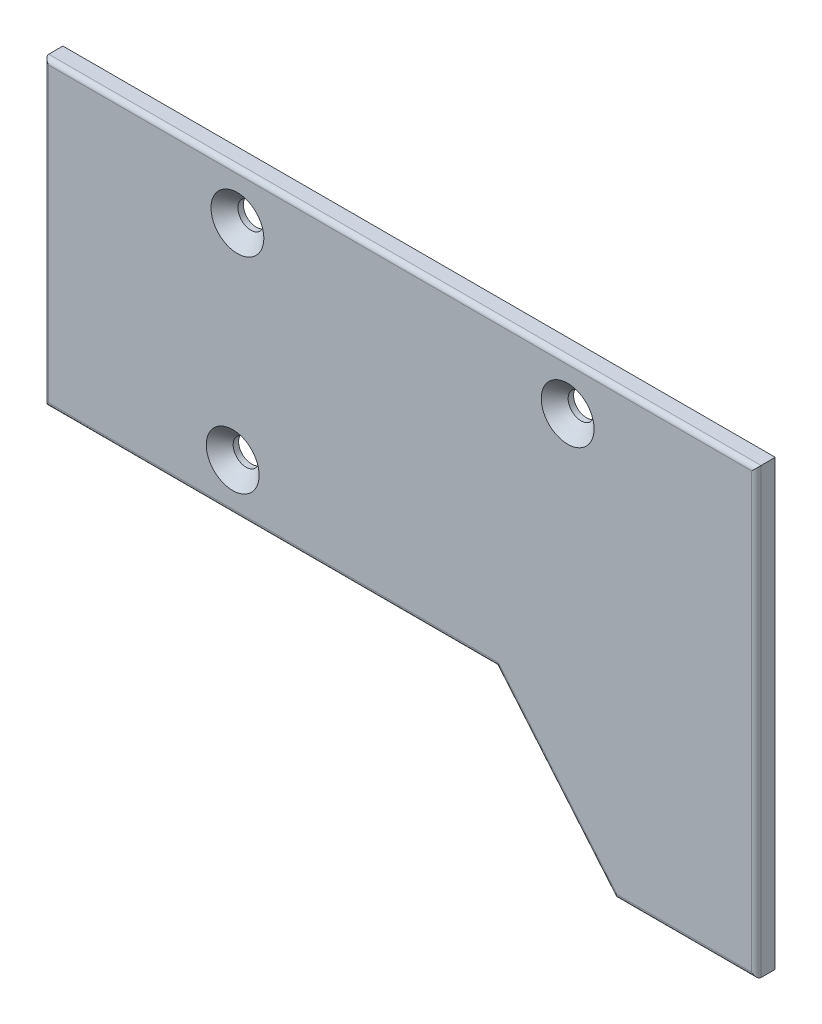
ISO-10303-21;
HEADER;
FILE_DESCRIPTION(('STEP AP214'),'2;1');
FILE_NAME('part.step','',(''),(''),'','','');
FILE_SCHEMA(('AUTOMOTIVE_DESIGN { 1 0 10303 214 1 1 1 1 }'));
ENDSEC;
DATA;
#1=APPLICATION_CONTEXT('core data for automotive mechanical design processes');
#2=APPLICATION_PROTOCOL_DEFINITION('international standard','automotive_design',2000,#1);
#3=PRODUCT_CONTEXT('',#1,'mechanical');
#4=PRODUCT('Part','Part','',(#3));
#5=PRODUCT_RELATED_PRODUCT_CATEGORY('part','',(#4));
#6=PRODUCT_DEFINITION_FORMATION('','',#4);
#7=PRODUCT_DEFINITION_CONTEXT('part definition',#1,'design');
#8=PRODUCT_DEFINITION('design','',#6,#7);
#9=PRODUCT_DEFINITION_SHAPE('','',#8);
#10=(LENGTH_UNIT() NAMED_UNIT(*) SI_UNIT(.MILLI.,.METRE.));
#11=(NAMED_UNIT(*) PLANE_ANGLE_UNIT() SI_UNIT($,.RADIAN.));
#12=(NAMED_UNIT(*) SI_UNIT($,.STERADIAN.) SOLID_ANGLE_UNIT());
#13=UNCERTAINTY_MEASURE_WITH_UNIT(LENGTH_MEASURE(1.E-05),#10,'distance_accuracy_value','');
#14=(GEOMETRIC_REPRESENTATION_CONTEXT(3) GLOBAL_UNCERTAINTY_ASSIGNED_CONTEXT((#13)) GLOBAL_UNIT_ASSIGNED_CONTEXT((#10,
#11,#12)) REPRESENTATION_CONTEXT('',''));
#15=CARTESIAN_POINT('',(0.,0.,0.));
#16=DIRECTION('',(0.,0.,1.));
#17=DIRECTION('',(1.,0.,0.));
#18=AXIS2_PLACEMENT_3D('',#15,#16,#17);
#19=CARTESIAN_POINT('',(0.,0.,4.));
#20=DIRECTION('',(0.,0.,-1.));
#21=DIRECTION('',(-1.,0.,0.));
#22=AXIS2_PLACEMENT_3D('',#19,#20,#21);
#23=PLANE('',#22);
#24=DIRECTION('',(1.,0.,0.));
#25=VECTOR('',#24,1.);
#26=CARTESIAN_POINT('',(0.,-28.9999999999999,4.));
#27=LINE('',#26,#25);
#28=CARTESIAN_POINT('',(121.466307658155,-29.,4.));
#29=VERTEX_POINT('',#28);
#30=CARTESIAN_POINT('',(150.,-29.,4.));
#31=VERTEX_POINT('',#30);
#32=EDGE_CURVE('E164',#29,#31,#27,.T.);
#33=ORIENTED_EDGE('',*,*,#32,.T.);
#34=DIRECTION('',(0.,1.,0.));
#35=VECTOR('',#34,1.);
#36=CARTESIAN_POINT('',(150.,0.,4.));
#37=LINE('',#36,#35);
#38=CARTESIAN_POINT('',(150.,63.,4.));
#39=VERTEX_POINT('',#38);
#40=EDGE_CURVE('E166',#31,#39,#37,.T.);
#41=ORIENTED_EDGE('',*,*,#40,.T.);
#42=DIRECTION('',(-1.,0.,0.));
#43=VECTOR('',#42,1.);
#44=CARTESIAN_POINT('',(0.,63.,4.));
#45=LINE('',#44,#43);
#46=CARTESIAN_POINT('',(1.,63.,4.));
#47=VERTEX_POINT('',#46);
#48=EDGE_CURVE('E117',#39,#47,#45,.T.);
#49=ORIENTED_EDGE('',*,*,#48,.T.);
#50=DIRECTION('',(0.,-1.,0.));
#51=VECTOR('',#50,1.);
#52=CARTESIAN_POINT('',(1.,0.,4.));
#53=LINE('',#52,#51);
#54=CARTESIAN_POINT('',(1.,1.,4.));
#55=VERTEX_POINT('',#54);
#56=EDGE_CURVE('E158',#47,#55,#53,.T.);
#57=ORIENTED_EDGE('',*,*,#56,.T.);
#58=DIRECTION('',(1.,0.,0.));
#59=VECTOR('',#58,1.);
#60=CARTESIAN_POINT('',(0.,1.,4.));
#61=LINE('',#60,#59);
#62=CARTESIAN_POINT('',(96.2933187228367,1.,4.));
#63=VERTEX_POINT('',#62);
#64=EDGE_CURVE('E160',#55,#63,#61,.T.);
#65=ORIENTED_EDGE('',*,*,#64,.T.);
#66=DIRECTION('',(0.642787609686538,-0.766044443118979,0.));
#67=VECTOR('',#66,1.);
#68=CARTESIAN_POINT('',(56.9996428967854,47.8283793319291,4.));
#69=LINE('',#68,#67);
#70=EDGE_CURVE('E162',#63,#29,#69,.T.);
#71=ORIENTED_EDGE('',*,*,#70,.T.);
#72=EDGE_LOOP('',(#33,#41,#49,#57,#65,#71));
#73=FACE_BOUND('',#72,.T.);
#74=CARTESIAN_POINT('',(40.,9.99999999999999,4.));
#75=DIRECTION('',(0.,0.,1.));
#76=DIRECTION('',(1.,0.,0.));
#77=AXIS2_PLACEMENT_3D('',#74,#75,#76);
#78=CIRCLE('',#77,5.6);
#79=CARTESIAN_POINT('',(45.6,9.99999999999999,4.));
#80=VERTEX_POINT('',#79);
#81=EDGE_CURVE('E205',#80,#80,#78,.T.);
#82=ORIENTED_EDGE('',*,*,#81,.F.);
#83=EDGE_LOOP('',(#82));
#84=FACE_BOUND('',#83,.T.);
#85=CARTESIAN_POINT('',(111.,54.,4.));
#86=DIRECTION('',(0.,0.,1.));
#87=DIRECTION('',(1.,0.,0.));
#88=AXIS2_PLACEMENT_3D('',#85,#86,#87);
#89=CIRCLE('',#88,5.59999999999999);
#90=CARTESIAN_POINT('',(116.6,54.,4.));
#91=VERTEX_POINT('',#90);
#92=EDGE_CURVE('E211',#91,#91,#89,.T.);
#93=ORIENTED_EDGE('',*,*,#92,.F.);
#94=EDGE_LOOP('',(#93));
#95=FACE_BOUND('',#94,.T.);
#96=CARTESIAN_POINT('',(41.,54.,4.));
#97=DIRECTION('',(0.,0.,1.));
#98=DIRECTION('',(1.,0.,0.));
#99=AXIS2_PLACEMENT_3D('',#96,#97,#98);
#100=CIRCLE('',#99,5.6);
#101=CARTESIAN_POINT('',(46.6,54.,4.));
#102=VERTEX_POINT('',#101);
#103=EDGE_CURVE('E217',#102,#102,#100,.T.);
#104=ORIENTED_EDGE('',*,*,#103,.F.);
#105=EDGE_LOOP('',(#104));
#106=FACE_BOUND('',#105,.T.);
#107=ADVANCED_FACE('F37',(#73,#84,#95,#106),#23,.F.);
#108=CARTESIAN_POINT('',(41.,54.,4.));
#109=DIRECTION('',(0.,0.,-1.));
#110=DIRECTION('',(-1.,0.,0.));
#111=AXIS2_PLACEMENT_3D('',#108,#109,#110);
#112=CYLINDRICAL_SURFACE('',#111,2.75);
#113=CARTESIAN_POINT('',(41.,54.,0.));
#114=DIRECTION('',(0.,0.,1.));
#115=DIRECTION('',(1.,0.,0.));
#116=AXIS2_PLACEMENT_3D('',#113,#114,#115);
#117=CIRCLE('',#116,2.75);
#118=CARTESIAN_POINT('',(43.75,54.,0.));
#119=VERTEX_POINT('',#118);
#120=EDGE_CURVE('E133',#119,#119,#117,.T.);
#121=ORIENTED_EDGE('',*,*,#120,.F.);
#122=EDGE_LOOP('',(#121));
#123=FACE_BOUND('',#122,.T.);
#124=CARTESIAN_POINT('',(41.,54.,1.15));
#125=DIRECTION('',(0.,0.,1.));
#126=DIRECTION('',(1.,0.,0.));
#127=AXIS2_PLACEMENT_3D('',#124,#125,#126);
#128=CIRCLE('',#127,2.75);
#129=CARTESIAN_POINT('',(43.75,54.,1.15));
#130=VERTEX_POINT('',#129);
#131=EDGE_CURVE('E214',#130,#130,#128,.T.);
#132=ORIENTED_EDGE('',*,*,#131,.T.);
#133=EDGE_LOOP('',(#132));
#134=FACE_BOUND('',#133,.T.);
#135=ADVANCED_FACE('F224',(#123,#134),#112,.F.);
#136=CARTESIAN_POINT('',(40.,9.99999999999999,4.));
#137=DIRECTION('',(0.,0.,-1.));
#138=DIRECTION('',(-1.,0.,0.));
#139=AXIS2_PLACEMENT_3D('',#136,#137,#138);
#140=CYLINDRICAL_SURFACE('',#139,2.75);
#141=CARTESIAN_POINT('',(40.,9.99999999999999,0.));
#142=DIRECTION('',(0.,0.,1.));
#143=DIRECTION('',(1.,0.,0.));
#144=AXIS2_PLACEMENT_3D('',#141,#142,#143);
#145=CIRCLE('',#144,2.75);
#146=CARTESIAN_POINT('',(42.75,9.99999999999999,0.));
#147=VERTEX_POINT('',#146);
#148=EDGE_CURVE('E193',#147,#147,#145,.T.);
#149=ORIENTED_EDGE('',*,*,#148,.F.);
#150=EDGE_LOOP('',(#149));
#151=FACE_BOUND('',#150,.T.);
#152=CARTESIAN_POINT('',(40.,9.99999999999999,1.15));
#153=DIRECTION('',(0.,0.,1.));
#154=DIRECTION('',(1.,0.,0.));
#155=AXIS2_PLACEMENT_3D('',#152,#153,#154);
#156=CIRCLE('',#155,2.75);
#157=CARTESIAN_POINT('',(42.75,9.99999999999999,1.15));
#158=VERTEX_POINT('',#157);
#159=EDGE_CURVE('E180',#158,#158,#156,.T.);
#160=ORIENTED_EDGE('',*,*,#159,.T.);
#161=EDGE_LOOP('',(#160));
#162=FACE_BOUND('',#161,.T.);
#163=ADVANCED_FACE('F230',(#151,#162),#140,.F.);
#164=CARTESIAN_POINT('',(0.,0.,0.));
#165=DIRECTION('',(0.,0.,-1.));
#166=DIRECTION('',(-1.,0.,0.));
#167=AXIS2_PLACEMENT_3D('',#164,#165,#166);
#168=PLANE('',#167);
#169=CARTESIAN_POINT('',(111.,54.,0.));
#170=DIRECTION('',(0.,0.,1.));
#171=DIRECTION('',(1.,0.,0.));
#172=AXIS2_PLACEMENT_3D('',#169,#170,#171);
#173=CIRCLE('',#172,2.75000000000001);
#174=CARTESIAN_POINT('',(113.75,54.,0.));
#175=VERTEX_POINT('',#174);
#176=EDGE_CURVE('E136',#175,#175,#173,.T.);
#177=ORIENTED_EDGE('',*,*,#176,.T.);
#178=EDGE_LOOP('',(#177));
#179=FACE_BOUND('',#178,.T.);
#180=DIRECTION('',(1.,0.,0.));
#181=VECTOR('',#180,1.);
#182=CARTESIAN_POINT('',(95.8270110646818,0.,0.));
#183=LINE('',#182,#181);
#184=CARTESIAN_POINT('',(0.,0.,0.));
#185=VERTEX_POINT('',#184);
#186=CARTESIAN_POINT('',(95.8270110646818,0.,0.));
#187=VERTEX_POINT('',#186);
#188=EDGE_CURVE('E125',#185,#187,#183,.T.);
#189=ORIENTED_EDGE('',*,*,#188,.F.);
#190=DIRECTION('',(0.,-1.,0.));
#191=VECTOR('',#190,1.);
#192=CARTESIAN_POINT('',(0.,0.,0.));
#193=LINE('',#192,#191);
#194=CARTESIAN_POINT('',(0.,64.,0.));
#195=VERTEX_POINT('',#194);
#196=EDGE_CURVE('E147',#195,#185,#193,.T.);
#197=ORIENTED_EDGE('',*,*,#196,.F.);
#198=DIRECTION('',(-1.,0.,0.));
#199=VECTOR('',#198,1.);
#200=CARTESIAN_POINT('',(0.,64.,0.));
#201=LINE('',#200,#199);
#202=CARTESIAN_POINT('',(151.,64.,0.));
#203=VERTEX_POINT('',#202);
#204=EDGE_CURVE('E144',#203,#195,#201,.T.);
#205=ORIENTED_EDGE('',*,*,#204,.F.);
#206=DIRECTION('',(0.,1.,0.));
#207=VECTOR('',#206,1.);
#208=CARTESIAN_POINT('',(151.,64.,0.));
#209=LINE('',#208,#207);
#210=CARTESIAN_POINT('',(151.,-30.,0.));
#211=VERTEX_POINT('',#210);
#212=EDGE_CURVE('E141',#211,#203,#209,.T.);
#213=ORIENTED_EDGE('',*,*,#212,.F.);
#214=DIRECTION('',(1.,0.,0.));
#215=VECTOR('',#214,1.);
#216=CARTESIAN_POINT('',(151.,-30.,0.));
#217=LINE('',#216,#215);
#218=CARTESIAN_POINT('',(121.,-30.,0.));
#219=VERTEX_POINT('',#218);
#220=EDGE_CURVE('E128',#219,#211,#217,.T.);
#221=ORIENTED_EDGE('',*,*,#220,.F.);
#222=DIRECTION('',(0.642787609686538,-0.766044443118979,0.));
#223=VECTOR('',#222,1.);
#224=CARTESIAN_POINT('',(121.,-30.,0.));
#225=LINE('',#224,#223);
#226=EDGE_CURVE('E112',#187,#219,#225,.T.);
#227=ORIENTED_EDGE('',*,*,#226,.F.);
#228=EDGE_LOOP('',(#189,#197,#205,#213,#221,#227));
#229=FACE_BOUND('',#228,.T.);
#230=ORIENTED_EDGE('',*,*,#120,.T.);
#231=EDGE_LOOP('',(#230));
#232=FACE_BOUND('',#231,.T.);
#233=ORIENTED_EDGE('',*,*,#148,.T.);
#234=EDGE_LOOP('',(#233));
#235=FACE_BOUND('',#234,.T.);
#236=ADVANCED_FACE('F122',(#179,#229,#232,#235),#168,.T.);
#237=CARTESIAN_POINT('',(95.8270110646818,0.,4.));
#238=DIRECTION('',(0.,1.,0.));
#239=DIRECTION('',(-1.,0.,0.));
#240=AXIS2_PLACEMENT_3D('',#237,#238,#239);
#241=PLANE('',#240);
#242=DIRECTION('',(0.,0.,-1.));
#243=VECTOR('',#242,1.);
#244=CARTESIAN_POINT('',(95.8270110646818,0.,4.));
#245=LINE('',#244,#243);
#246=CARTESIAN_POINT('',(95.8270110646818,0.,3.));
#247=VERTEX_POINT('',#246);
#248=EDGE_CURVE('E108',#247,#187,#245,.T.);
#249=ORIENTED_EDGE('',*,*,#248,.F.);
#250=DIRECTION('',(1.,0.,0.));
#251=VECTOR('',#250,1.);
#252=CARTESIAN_POINT('',(95.8270110646818,0.,3.));
#253=LINE('',#252,#251);
#254=CARTESIAN_POINT('',(0.,0.,3.));
#255=VERTEX_POINT('',#254);
#256=EDGE_CURVE('E61',#247,#255,#253,.F.);
#257=ORIENTED_EDGE('',*,*,#256,.T.);
#258=DIRECTION('',(0.,0.,-1.));
#259=VECTOR('',#258,1.);
#260=CARTESIAN_POINT('',(0.,0.,4.));
#261=LINE('',#260,#259);
#262=EDGE_CURVE('E131',#255,#185,#261,.T.);
#263=ORIENTED_EDGE('',*,*,#262,.T.);
#264=ORIENTED_EDGE('',*,*,#188,.T.);
#265=EDGE_LOOP('',(#249,#257,#263,#264));
#266=FACE_BOUND('',#265,.T.);
#267=ADVANCED_FACE('F130',(#266),#241,.F.);
#268=CARTESIAN_POINT('',(121.,-30.,4.));
#269=DIRECTION('',(0.766044443118979,0.642787609686538,0.));
#270=DIRECTION('',(-0.642787609686538,0.766044443118979,0.));
#271=AXIS2_PLACEMENT_3D('',#268,#269,#270);
#272=PLANE('',#271);
#273=DIRECTION('',(0.,0.,-1.));
#274=VECTOR('',#273,1.);
#275=CARTESIAN_POINT('',(121.,-30.,4.));
#276=LINE('',#275,#274);
#277=CARTESIAN_POINT('',(121.,-30.,3.));
#278=VERTEX_POINT('',#277);
#279=EDGE_CURVE('E118',#278,#219,#276,.T.);
#280=ORIENTED_EDGE('',*,*,#279,.F.);
#281=DIRECTION('',(0.642787609686538,-0.766044443118979,0.));
#282=VECTOR('',#281,1.);
#283=CARTESIAN_POINT('',(121.,-30.,3.));
#284=LINE('',#283,#282);
#285=EDGE_CURVE('E115',#278,#247,#284,.F.);
#286=ORIENTED_EDGE('',*,*,#285,.T.);
#287=ORIENTED_EDGE('',*,*,#248,.T.);
#288=ORIENTED_EDGE('',*,*,#226,.T.);
#289=EDGE_LOOP('',(#280,#286,#287,#288));
#290=FACE_BOUND('',#289,.T.);
#291=ADVANCED_FACE('F111',(#290),#272,.F.);
#292=CARTESIAN_POINT('',(151.,-30.,4.));
#293=DIRECTION('',(0.,1.,0.));
#294=DIRECTION('',(-1.,0.,0.));
#295=AXIS2_PLACEMENT_3D('',#292,#293,#294);
#296=PLANE('',#295);
#297=DIRECTION('',(0.,0.,-1.));
#298=VECTOR('',#297,1.);
#299=CARTESIAN_POINT('',(151.,-30.,4.));
#300=LINE('',#299,#298);
#301=CARTESIAN_POINT('',(151.,-30.,3.));
#302=VERTEX_POINT('',#301);
#303=EDGE_CURVE('E154',#302,#211,#300,.T.);
#304=ORIENTED_EDGE('',*,*,#303,.F.);
#305=DIRECTION('',(1.,0.,0.));
#306=VECTOR('',#305,1.);
#307=CARTESIAN_POINT('',(151.,-30.,3.));
#308=LINE('',#307,#306);
#309=EDGE_CURVE('E172',#302,#278,#308,.F.);
#310=ORIENTED_EDGE('',*,*,#309,.T.);
#311=ORIENTED_EDGE('',*,*,#279,.T.);
#312=ORIENTED_EDGE('',*,*,#220,.T.);
#313=EDGE_LOOP('',(#304,#310,#311,#312));
#314=FACE_BOUND('',#313,.T.);
#315=ADVANCED_FACE('F250',(#314),#296,.F.);
#316=CARTESIAN_POINT('',(151.,64.,4.));
#317=DIRECTION('',(-1.,0.,0.));
#318=DIRECTION('',(0.,-1.,0.));
#319=AXIS2_PLACEMENT_3D('',#316,#317,#318);
#320=PLANE('',#319);
#321=DIRECTION('',(0.,0.,-1.));
#322=VECTOR('',#321,1.);
#323=CARTESIAN_POINT('',(151.,64.,4.));
#324=LINE('',#323,#322);
#325=CARTESIAN_POINT('',(151.,64.,3.));
#326=VERTEX_POINT('',#325);
#327=EDGE_CURVE('E152',#326,#203,#324,.T.);
#328=ORIENTED_EDGE('',*,*,#327,.F.);
#329=DIRECTION('',(0.,1.,0.));
#330=VECTOR('',#329,1.);
#331=CARTESIAN_POINT('',(151.,64.,3.));
#332=LINE('',#331,#330);
#333=EDGE_CURVE('E169',#326,#302,#332,.F.);
#334=ORIENTED_EDGE('',*,*,#333,.T.);
#335=ORIENTED_EDGE('',*,*,#303,.T.);
#336=ORIENTED_EDGE('',*,*,#212,.T.);
#337=EDGE_LOOP('',(#328,#334,#335,#336));
#338=FACE_BOUND('',#337,.T.);
#339=ADVANCED_FACE('F246',(#338),#320,.F.);
#340=CARTESIAN_POINT('',(0.,64.,4.));
#341=DIRECTION('',(0.,-1.,0.));
#342=DIRECTION('',(0.,0.,-1.));
#343=AXIS2_PLACEMENT_3D('',#340,#341,#342);
#344=PLANE('',#343);
#345=DIRECTION('',(0.,0.,-1.));
#346=VECTOR('',#345,1.);
#347=CARTESIAN_POINT('',(0.,64.,4.));
#348=LINE('',#347,#346);
#349=CARTESIAN_POINT('',(0.,64.,3.));
#350=VERTEX_POINT('',#349);
#351=EDGE_CURVE('E150',#350,#195,#348,.T.);
#352=ORIENTED_EDGE('',*,*,#351,.F.);
#353=DIRECTION('',(-1.,0.,0.));
#354=VECTOR('',#353,1.);
#355=CARTESIAN_POINT('',(0.,64.,3.));
#356=LINE('',#355,#354);
#357=EDGE_CURVE('E11',#350,#326,#356,.F.);
#358=ORIENTED_EDGE('',*,*,#357,.T.);
#359=ORIENTED_EDGE('',*,*,#327,.T.);
#360=ORIENTED_EDGE('',*,*,#204,.T.);
#361=EDGE_LOOP('',(#352,#358,#359,#360));
#362=FACE_BOUND('',#361,.T.);
#363=ADVANCED_FACE('F243',(#362),#344,.F.);
#364=CARTESIAN_POINT('',(0.,0.,4.));
#365=DIRECTION('',(1.,0.,0.));
#366=DIRECTION('',(0.,0.,-1.));
#367=AXIS2_PLACEMENT_3D('',#364,#365,#366);
#368=PLANE('',#367);
#369=ORIENTED_EDGE('',*,*,#262,.F.);
#370=DIRECTION('',(0.,-1.,0.));
#371=VECTOR('',#370,1.);
#372=CARTESIAN_POINT('',(0.,0.,3.));
#373=LINE('',#372,#371);
#374=EDGE_CURVE('E46',#255,#350,#373,.F.);
#375=ORIENTED_EDGE('',*,*,#374,.T.);
#376=ORIENTED_EDGE('',*,*,#351,.T.);
#377=ORIENTED_EDGE('',*,*,#196,.T.);
#378=EDGE_LOOP('',(#369,#375,#376,#377));
#379=FACE_BOUND('',#378,.T.);
#380=ADVANCED_FACE('F239',(#379),#368,.F.);
#381=CARTESIAN_POINT('',(111.,54.,4.));
#382=DIRECTION('',(0.,0.,-1.));
#383=DIRECTION('',(-1.,0.,0.));
#384=AXIS2_PLACEMENT_3D('',#381,#382,#383);
#385=CYLINDRICAL_SURFACE('',#384,2.75000000000001);
#386=CARTESIAN_POINT('',(111.,54.,1.15));
#387=DIRECTION('',(0.,0.,1.));
#388=DIRECTION('',(1.,0.,0.));
#389=AXIS2_PLACEMENT_3D('',#386,#387,#388);
#390=CIRCLE('',#389,2.75);
#391=CARTESIAN_POINT('',(113.75,54.,1.15));
#392=VERTEX_POINT('',#391);
#393=EDGE_CURVE('E208',#392,#392,#390,.T.);
#394=ORIENTED_EDGE('',*,*,#393,.T.);
#395=EDGE_LOOP('',(#394));
#396=FACE_BOUND('',#395,.T.);
#397=ORIENTED_EDGE('',*,*,#176,.F.);
#398=EDGE_LOOP('',(#397));
#399=FACE_BOUND('',#398,.T.);
#400=ADVANCED_FACE('F242',(#396,#399),#385,.F.);
#401=CARTESIAN_POINT('',(0.,1.,3.));
#402=DIRECTION('',(1.,0.,0.));
#403=DIRECTION('',(0.,1.,0.));
#404=AXIS2_PLACEMENT_3D('',#401,#402,#403);
#405=CYLINDRICAL_SURFACE('',#404,1.);
#406=CARTESIAN_POINT('',(1.,1.,3.));
#407=DIRECTION('',(0.707106781186547,-0.707106781186547,0.));
#408=DIRECTION('',(-0.707106781186547,-0.707106781186547,0.));
#409=AXIS2_PLACEMENT_3D('',#406,#407,#408);
#410=ELLIPSE('',#409,1.41421356237309,1.);
#411=EDGE_CURVE('E187',#255,#55,#410,.F.);
#412=ORIENTED_EDGE('',*,*,#411,.F.);
#413=ORIENTED_EDGE('',*,*,#256,.F.);
#414=CARTESIAN_POINT('',(96.2933187228367,0.999999999999997,3.));
#415=DIRECTION('',(0.906307787036649,-0.4226182617407,0.));
#416=DIRECTION('',(-0.4226182617407,-0.906307787036649,0.));
#417=AXIS2_PLACEMENT_3D('',#414,#415,#416);
#418=ELLIPSE('',#417,1.10337791896249,1.);
#419=EDGE_CURVE('E41',#63,#247,#418,.T.);
#420=ORIENTED_EDGE('',*,*,#419,.F.);
#421=ORIENTED_EDGE('',*,*,#64,.F.);
#422=EDGE_LOOP('',(#412,#413,#420,#421));
#423=FACE_BOUND('',#422,.T.);
#424=ADVANCED_FACE('F39',(#423),#405,.T.);
#425=CARTESIAN_POINT('',(56.9996428967854,47.8283793319291,3.));
#426=DIRECTION('',(0.642787609686538,-0.766044443118979,0.));
#427=DIRECTION('',(0.766044443118979,0.642787609686538,0.));
#428=AXIS2_PLACEMENT_3D('',#425,#426,#427);
#429=CYLINDRICAL_SURFACE('',#428,1.);
#430=ORIENTED_EDGE('',*,*,#419,.T.);
#431=ORIENTED_EDGE('',*,*,#285,.F.);
#432=CARTESIAN_POINT('',(121.466307658155,-29.,3.));
#433=DIRECTION('',(0.906307787036649,-0.422618261740701,0.));
#434=DIRECTION('',(-0.422618261740701,-0.906307787036649,0.));
#435=AXIS2_PLACEMENT_3D('',#432,#433,#434);
#436=ELLIPSE('',#435,1.10337791896249,1.);
#437=EDGE_CURVE('E185',#29,#278,#436,.T.);
#438=ORIENTED_EDGE('',*,*,#437,.F.);
#439=ORIENTED_EDGE('',*,*,#70,.F.);
#440=EDGE_LOOP('',(#430,#431,#438,#439));
#441=FACE_BOUND('',#440,.T.);
#442=ADVANCED_FACE('F274',(#441),#429,.T.);
#443=CARTESIAN_POINT('',(1.,0.,3.));
#444=DIRECTION('',(0.,-1.,0.));
#445=DIRECTION('',(0.,0.,-1.));
#446=AXIS2_PLACEMENT_3D('',#443,#444,#445);
#447=CYLINDRICAL_SURFACE('',#446,1.);
#448=ORIENTED_EDGE('',*,*,#411,.T.);
#449=ORIENTED_EDGE('',*,*,#56,.F.);
#450=CARTESIAN_POINT('',(1.,63.,3.));
#451=DIRECTION('',(-0.707106781186547,-0.707106781186547,0.));
#452=DIRECTION('',(-0.707106781186547,0.707106781186547,0.));
#453=AXIS2_PLACEMENT_3D('',#450,#451,#452);
#454=ELLIPSE('',#453,1.41421356237309,1.);
#455=EDGE_CURVE('E182',#350,#47,#454,.F.);
#456=ORIENTED_EDGE('',*,*,#455,.F.);
#457=ORIENTED_EDGE('',*,*,#374,.F.);
#458=EDGE_LOOP('',(#448,#449,#456,#457));
#459=FACE_BOUND('',#458,.T.);
#460=ADVANCED_FACE('F271',(#459),#447,.T.);
#461=CARTESIAN_POINT('',(0.,-28.9999999999999,3.));
#462=DIRECTION('',(1.,0.,0.));
#463=DIRECTION('',(0.,1.,0.));
#464=AXIS2_PLACEMENT_3D('',#461,#462,#463);
#465=CYLINDRICAL_SURFACE('',#464,1.);
#466=ORIENTED_EDGE('',*,*,#437,.T.);
#467=ORIENTED_EDGE('',*,*,#309,.F.);
#468=CARTESIAN_POINT('',(150.,-29.,3.));
#469=DIRECTION('',(0.707106781186548,0.707106781186547,0.));
#470=DIRECTION('',(0.707106781186547,-0.707106781186548,0.));
#471=AXIS2_PLACEMENT_3D('',#468,#469,#470);
#472=ELLIPSE('',#471,1.4142135623731,1.);
#473=EDGE_CURVE('E179',#31,#302,#472,.T.);
#474=ORIENTED_EDGE('',*,*,#473,.F.);
#475=ORIENTED_EDGE('',*,*,#32,.F.);
#476=EDGE_LOOP('',(#466,#467,#474,#475));
#477=FACE_BOUND('',#476,.T.);
#478=ADVANCED_FACE('F267',(#477),#465,.T.);
#479=CARTESIAN_POINT('',(0.,63.,3.));
#480=DIRECTION('',(-1.,0.,0.));
#481=DIRECTION('',(0.,0.,1.));
#482=AXIS2_PLACEMENT_3D('',#479,#480,#481);
#483=CYLINDRICAL_SURFACE('',#482,1.);
#484=ORIENTED_EDGE('',*,*,#455,.T.);
#485=ORIENTED_EDGE('',*,*,#48,.F.);
#486=CARTESIAN_POINT('',(150.,63.,3.));
#487=DIRECTION('',(-0.707106781186548,0.707106781186547,0.));
#488=DIRECTION('',(-0.707106781186547,-0.707106781186548,0.));
#489=AXIS2_PLACEMENT_3D('',#486,#487,#488);
#490=ELLIPSE('',#489,1.41421356237309,1.);
#491=EDGE_CURVE('E177',#326,#39,#490,.F.);
#492=ORIENTED_EDGE('',*,*,#491,.F.);
#493=ORIENTED_EDGE('',*,*,#357,.F.);
#494=EDGE_LOOP('',(#484,#485,#492,#493));
#495=FACE_BOUND('',#494,.T.);
#496=ADVANCED_FACE('F263',(#495),#483,.T.);
#497=CARTESIAN_POINT('',(150.,0.,3.));
#498=DIRECTION('',(0.,1.,0.));
#499=DIRECTION('',(-1.,0.,0.));
#500=AXIS2_PLACEMENT_3D('',#497,#498,#499);
#501=CYLINDRICAL_SURFACE('',#500,1.);
#502=ORIENTED_EDGE('',*,*,#473,.T.);
#503=ORIENTED_EDGE('',*,*,#333,.F.);
#504=ORIENTED_EDGE('',*,*,#491,.T.);
#505=ORIENTED_EDGE('',*,*,#40,.F.);
#506=EDGE_LOOP('',(#502,#503,#504,#505));
#507=FACE_BOUND('',#506,.T.);
#508=ADVANCED_FACE('F259',(#507),#501,.T.);
#509=CARTESIAN_POINT('',(40.,9.99999999999999,4.));
#510=DIRECTION('',(0.,0.,1.));
#511=DIRECTION('',(1.,0.,0.));
#512=AXIS2_PLACEMENT_3D('',#509,#510,#511);
#513=CONICAL_SURFACE('',#512,5.6,0.785398163397449);
#514=ORIENTED_EDGE('',*,*,#159,.F.);
#515=EDGE_LOOP('',(#514));
#516=FACE_BOUND('',#515,.T.);
#517=ORIENTED_EDGE('',*,*,#81,.T.);
#518=EDGE_LOOP('',(#517));
#519=FACE_BOUND('',#518,.T.);
#520=ADVANCED_FACE('F262',(#516,#519),#513,.F.);
#521=CARTESIAN_POINT('',(111.,54.,4.));
#522=DIRECTION('',(0.,0.,1.));
#523=DIRECTION('',(1.,0.,0.));
#524=AXIS2_PLACEMENT_3D('',#521,#522,#523);
#525=CONICAL_SURFACE('',#524,5.59999999999999,0.785398163397447);
#526=ORIENTED_EDGE('',*,*,#393,.F.);
#527=EDGE_LOOP('',(#526));
#528=FACE_BOUND('',#527,.T.);
#529=ORIENTED_EDGE('',*,*,#92,.T.);
#530=EDGE_LOOP('',(#529));
#531=FACE_BOUND('',#530,.T.);
#532=ADVANCED_FACE('F307',(#528,#531),#525,.F.);
#533=CARTESIAN_POINT('',(41.,54.,4.));
#534=DIRECTION('',(0.,0.,1.));
#535=DIRECTION('',(1.,0.,0.));
#536=AXIS2_PLACEMENT_3D('',#533,#534,#535);
#537=CONICAL_SURFACE('',#536,5.6,0.785398163397449);
#538=ORIENTED_EDGE('',*,*,#131,.F.);
#539=EDGE_LOOP('',(#538));
#540=FACE_BOUND('',#539,.T.);
#541=ORIENTED_EDGE('',*,*,#103,.T.);
#542=EDGE_LOOP('',(#541));
#543=FACE_BOUND('',#542,.T.);
#544=ADVANCED_FACE('F221',(#540,#543),#537,.F.);
#545=CLOSED_SHELL('',(#107,#135,#163,#236,#267,#291,#315,#339,#363,#380,#400,#424,#442,#460,
#478,#496,#508,#520,#532,#544));
#546=MANIFOLD_SOLID_BREP('B2',#545);
#547=ADVANCED_BREP_SHAPE_REPRESENTATION('',(#18,#546),#14);
#548=SHAPE_DEFINITION_REPRESENTATION(#9,#547);
ENDSEC;
END-ISO-10303-21;
